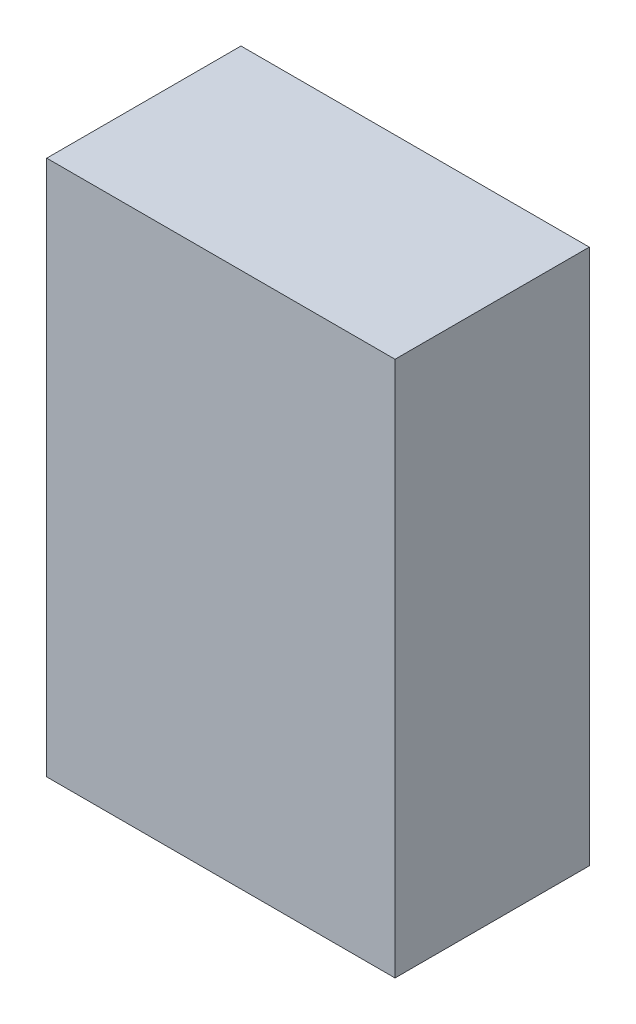
ISO-10303-21;
HEADER;
FILE_DESCRIPTION(('STEP AP214'),'2;1');
FILE_NAME('part.step','',(''),(''),'','','');
FILE_SCHEMA(('AUTOMOTIVE_DESIGN { 1 0 10303 214 1 1 1 1 }'));
ENDSEC;
DATA;
#1=APPLICATION_CONTEXT('core data for automotive mechanical design processes');
#2=APPLICATION_PROTOCOL_DEFINITION('international standard','automotive_design',2000,#1);
#3=PRODUCT_CONTEXT('',#1,'mechanical');
#4=PRODUCT('Part','Part','',(#3));
#5=PRODUCT_RELATED_PRODUCT_CATEGORY('part','',(#4));
#6=PRODUCT_DEFINITION_FORMATION('','',#4);
#7=PRODUCT_DEFINITION_CONTEXT('part definition',#1,'design');
#8=PRODUCT_DEFINITION('design','',#6,#7);
#9=PRODUCT_DEFINITION_SHAPE('','',#8);
#10=(LENGTH_UNIT() NAMED_UNIT(*) SI_UNIT(.MILLI.,.METRE.));
#11=(NAMED_UNIT(*) PLANE_ANGLE_UNIT() SI_UNIT($,.RADIAN.));
#12=(NAMED_UNIT(*) SI_UNIT($,.STERADIAN.) SOLID_ANGLE_UNIT());
#13=UNCERTAINTY_MEASURE_WITH_UNIT(LENGTH_MEASURE(1.E-05),#10,'distance_accuracy_value','');
#14=(GEOMETRIC_REPRESENTATION_CONTEXT(3) GLOBAL_UNCERTAINTY_ASSIGNED_CONTEXT((#13)) GLOBAL_UNIT_ASSIGNED_CONTEXT((#10,
#11,#12)) REPRESENTATION_CONTEXT('',''));
#15=CARTESIAN_POINT('',(0.,0.,0.));
#16=DIRECTION('',(0.,0.,1.));
#17=DIRECTION('',(1.,0.,0.));
#18=AXIS2_PLACEMENT_3D('',#15,#16,#17);
#19=CARTESIAN_POINT('',(0.,1016.,0.));
#20=DIRECTION('',(1.,0.,0.));
#21=DIRECTION('',(0.,0.,-1.));
#22=AXIS2_PLACEMENT_3D('',#19,#20,#21);
#23=PLANE('',#22);
#24=DIRECTION('',(0.,0.,1.));
#25=VECTOR('',#24,1.);
#26=CARTESIAN_POINT('',(0.,0.,0.));
#27=LINE('',#26,#25);
#28=CARTESIAN_POINT('',(0.,0.,-368.3));
#29=VERTEX_POINT('',#28);
#30=CARTESIAN_POINT('',(0.,0.,0.));
#31=VERTEX_POINT('',#30);
#32=EDGE_CURVE('E94',#29,#31,#27,.T.);
#33=ORIENTED_EDGE('',*,*,#32,.T.);
#34=DIRECTION('',(0.,-1.,0.));
#35=VECTOR('',#34,1.);
#36=CARTESIAN_POINT('',(0.,1016.,0.));
#37=LINE('',#36,#35);
#38=CARTESIAN_POINT('',(0.,1016.,0.));
#39=VERTEX_POINT('',#38);
#40=EDGE_CURVE('E11',#39,#31,#37,.T.);
#41=ORIENTED_EDGE('',*,*,#40,.F.);
#42=DIRECTION('',(0.,0.,1.));
#43=VECTOR('',#42,1.);
#44=CARTESIAN_POINT('',(0.,1016.,0.));
#45=LINE('',#44,#43);
#46=CARTESIAN_POINT('',(0.,1016.,-368.3));
#47=VERTEX_POINT('',#46);
#48=EDGE_CURVE('E82',#47,#39,#45,.T.);
#49=ORIENTED_EDGE('',*,*,#48,.F.);
#50=DIRECTION('',(0.,-1.,0.));
#51=VECTOR('',#50,1.);
#52=CARTESIAN_POINT('',(0.,1016.,-368.3));
#53=LINE('',#52,#51);
#54=EDGE_CURVE('E90',#47,#29,#53,.T.);
#55=ORIENTED_EDGE('',*,*,#54,.T.);
#56=EDGE_LOOP('',(#33,#41,#49,#55));
#57=FACE_BOUND('',#56,.T.);
#58=ADVANCED_FACE('F31',(#57),#23,.F.);
#59=CARTESIAN_POINT('',(0.,1016.,0.));
#60=DIRECTION('',(0.,0.,-1.));
#61=DIRECTION('',(-1.,0.,0.));
#62=AXIS2_PLACEMENT_3D('',#59,#60,#61);
#63=PLANE('',#62);
#64=DIRECTION('',(1.,0.,0.));
#65=VECTOR('',#64,1.);
#66=CARTESIAN_POINT('',(0.,0.,0.));
#67=LINE('',#66,#65);
#68=CARTESIAN_POINT('',(660.4,0.,0.));
#69=VERTEX_POINT('',#68);
#70=EDGE_CURVE('E86',#31,#69,#67,.T.);
#71=ORIENTED_EDGE('',*,*,#70,.T.);
#72=DIRECTION('',(0.,-1.,0.));
#73=VECTOR('',#72,1.);
#74=CARTESIAN_POINT('',(660.4,1016.,0.));
#75=LINE('',#74,#73);
#76=CARTESIAN_POINT('',(660.4,1016.,0.));
#77=VERTEX_POINT('',#76);
#78=EDGE_CURVE('E39',#77,#69,#75,.T.);
#79=ORIENTED_EDGE('',*,*,#78,.F.);
#80=DIRECTION('',(1.,0.,0.));
#81=VECTOR('',#80,1.);
#82=CARTESIAN_POINT('',(0.,1016.,0.));
#83=LINE('',#82,#81);
#84=EDGE_CURVE('E77',#39,#77,#83,.T.);
#85=ORIENTED_EDGE('',*,*,#84,.F.);
#86=ORIENTED_EDGE('',*,*,#40,.T.);
#87=EDGE_LOOP('',(#71,#79,#85,#86));
#88=FACE_BOUND('',#87,.T.);
#89=ADVANCED_FACE('F85',(#88),#63,.F.);
#90=CARTESIAN_POINT('',(660.4,1016.,0.));
#91=DIRECTION('',(-1.,0.,0.));
#92=DIRECTION('',(0.,0.,1.));
#93=AXIS2_PLACEMENT_3D('',#90,#91,#92);
#94=PLANE('',#93);
#95=DIRECTION('',(0.,0.,-1.));
#96=VECTOR('',#95,1.);
#97=CARTESIAN_POINT('',(660.4,0.,0.));
#98=LINE('',#97,#96);
#99=CARTESIAN_POINT('',(660.4,0.,-368.3));
#100=VERTEX_POINT('',#99);
#101=EDGE_CURVE('E64',#69,#100,#98,.T.);
#102=ORIENTED_EDGE('',*,*,#101,.T.);
#103=DIRECTION('',(0.,-1.,0.));
#104=VECTOR('',#103,1.);
#105=CARTESIAN_POINT('',(660.4,1016.,-368.3));
#106=LINE('',#105,#104);
#107=CARTESIAN_POINT('',(660.4,1016.,-368.3));
#108=VERTEX_POINT('',#107);
#109=EDGE_CURVE('E87',#108,#100,#106,.T.);
#110=ORIENTED_EDGE('',*,*,#109,.F.);
#111=DIRECTION('',(0.,0.,-1.));
#112=VECTOR('',#111,1.);
#113=CARTESIAN_POINT('',(660.4,1016.,0.));
#114=LINE('',#113,#112);
#115=EDGE_CURVE('E80',#77,#108,#114,.T.);
#116=ORIENTED_EDGE('',*,*,#115,.F.);
#117=ORIENTED_EDGE('',*,*,#78,.T.);
#118=EDGE_LOOP('',(#102,#110,#116,#117));
#119=FACE_BOUND('',#118,.T.);
#120=ADVANCED_FACE('F88',(#119),#94,.F.);
#121=CARTESIAN_POINT('',(0.,1016.,-368.3));
#122=DIRECTION('',(0.,0.,1.));
#123=DIRECTION('',(1.,0.,0.));
#124=AXIS2_PLACEMENT_3D('',#121,#122,#123);
#125=PLANE('',#124);
#126=DIRECTION('',(-1.,0.,0.));
#127=VECTOR('',#126,1.);
#128=CARTESIAN_POINT('',(0.,0.,-368.3));
#129=LINE('',#128,#127);
#130=EDGE_CURVE('E70',#100,#29,#129,.T.);
#131=ORIENTED_EDGE('',*,*,#130,.T.);
#132=ORIENTED_EDGE('',*,*,#54,.F.);
#133=DIRECTION('',(-1.,0.,0.));
#134=VECTOR('',#133,1.);
#135=CARTESIAN_POINT('',(0.,1016.,-368.3));
#136=LINE('',#135,#134);
#137=EDGE_CURVE('E47',#108,#47,#136,.T.);
#138=ORIENTED_EDGE('',*,*,#137,.F.);
#139=ORIENTED_EDGE('',*,*,#109,.T.);
#140=EDGE_LOOP('',(#131,#132,#138,#139));
#141=FACE_BOUND('',#140,.T.);
#142=ADVANCED_FACE('F101',(#141),#125,.F.);
#143=CARTESIAN_POINT('',(0.,1016.,-368.3));
#144=DIRECTION('',(0.,-1.,0.));
#145=DIRECTION('',(0.,0.,-1.));
#146=AXIS2_PLACEMENT_3D('',#143,#144,#145);
#147=PLANE('',#146);
#148=ORIENTED_EDGE('',*,*,#48,.T.);
#149=ORIENTED_EDGE('',*,*,#84,.T.);
#150=ORIENTED_EDGE('',*,*,#115,.T.);
#151=ORIENTED_EDGE('',*,*,#137,.T.);
#152=EDGE_LOOP('',(#148,#149,#150,#151));
#153=FACE_BOUND('',#152,.T.);
#154=ADVANCED_FACE('F78',(#153),#147,.F.);
#155=CARTESIAN_POINT('',(0.,0.,-368.3));
#156=DIRECTION('',(0.,-1.,0.));
#157=DIRECTION('',(0.,0.,-1.));
#158=AXIS2_PLACEMENT_3D('',#155,#156,#157);
#159=PLANE('',#158);
#160=ORIENTED_EDGE('',*,*,#32,.F.);
#161=ORIENTED_EDGE('',*,*,#130,.F.);
#162=ORIENTED_EDGE('',*,*,#101,.F.);
#163=ORIENTED_EDGE('',*,*,#70,.F.);
#164=EDGE_LOOP('',(#160,#161,#162,#163));
#165=FACE_BOUND('',#164,.T.);
#166=ADVANCED_FACE('F104',(#165),#159,.T.);
#167=CLOSED_SHELL('',(#58,#89,#120,#142,#154,#166));
#168=MANIFOLD_SOLID_BREP('B2',#167);
#169=ADVANCED_BREP_SHAPE_REPRESENTATION('',(#18,#168),#14);
#170=SHAPE_DEFINITION_REPRESENTATION(#9,#169);
ENDSEC;
END-ISO-10303-21;
